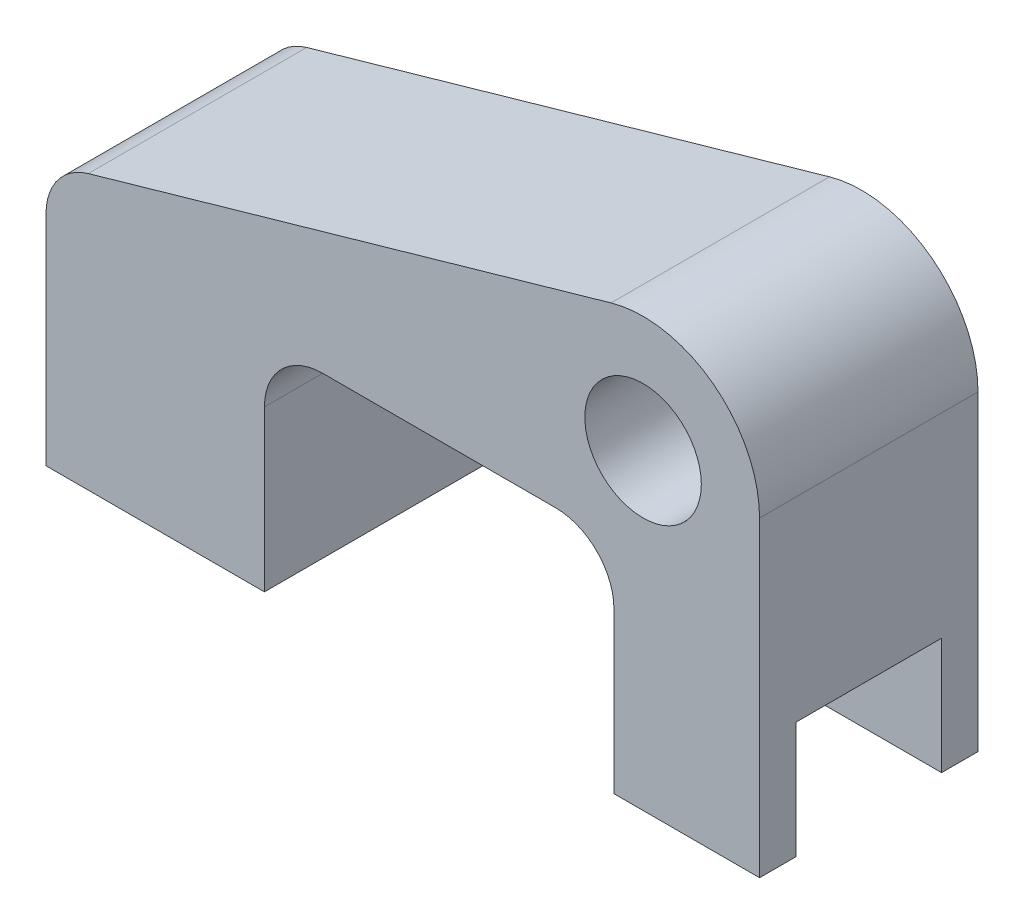
ISO-10303-21;
HEADER;
FILE_DESCRIPTION(('STEP AP214'),'2;1');
FILE_NAME('part.step','',(''),(''),'','','');
FILE_SCHEMA(('AUTOMOTIVE_DESIGN { 1 0 10303 214 1 1 1 1 }'));
ENDSEC;
DATA;
#1=APPLICATION_CONTEXT('core data for automotive mechanical design processes');
#2=APPLICATION_PROTOCOL_DEFINITION('international standard','automotive_design',2000,#1);
#3=PRODUCT_CONTEXT('',#1,'mechanical');
#4=PRODUCT('Part','Part','',(#3));
#5=PRODUCT_RELATED_PRODUCT_CATEGORY('part','',(#4));
#6=PRODUCT_DEFINITION_FORMATION('','',#4);
#7=PRODUCT_DEFINITION_CONTEXT('part definition',#1,'design');
#8=PRODUCT_DEFINITION('design','',#6,#7);
#9=PRODUCT_DEFINITION_SHAPE('','',#8);
#10=(LENGTH_UNIT() NAMED_UNIT(*) SI_UNIT(.MILLI.,.METRE.));
#11=(NAMED_UNIT(*) PLANE_ANGLE_UNIT() SI_UNIT($,.RADIAN.));
#12=(NAMED_UNIT(*) SI_UNIT($,.STERADIAN.) SOLID_ANGLE_UNIT());
#13=UNCERTAINTY_MEASURE_WITH_UNIT(LENGTH_MEASURE(1.E-05),#10,'distance_accuracy_value','');
#14=(GEOMETRIC_REPRESENTATION_CONTEXT(3) GLOBAL_UNCERTAINTY_ASSIGNED_CONTEXT((#13)) GLOBAL_UNIT_ASSIGNED_CONTEXT((#10,
#11,#12)) REPRESENTATION_CONTEXT('',''));
#15=CARTESIAN_POINT('',(0.,0.,0.));
#16=DIRECTION('',(0.,0.,1.));
#17=DIRECTION('',(1.,0.,0.));
#18=AXIS2_PLACEMENT_3D('',#15,#16,#17);
#19=CARTESIAN_POINT('',(18.3252312049049,17.4852420809224,15.));
#20=DIRECTION('',(1.,0.,0.));
#21=DIRECTION('',(0.,1.,0.));
#22=AXIS2_PLACEMENT_3D('',#19,#20,#21);
#23=PLANE('',#22);
#24=DIRECTION('',(0.,-1.,0.));
#25=VECTOR('',#24,1.);
#26=CARTESIAN_POINT('',(18.3252312049049,17.4852420809224,2.5));
#27=LINE('',#26,#25);
#28=CARTESIAN_POINT('',(18.3252312049049,10.4852420809224,2.5));
#29=VERTEX_POINT('',#28);
#30=CARTESIAN_POINT('',(18.3252312049049,2.48524208092244,2.5));
#31=VERTEX_POINT('',#30);
#32=EDGE_CURVE('E51',#29,#31,#27,.T.);
#33=ORIENTED_EDGE('',*,*,#32,.F.);
#34=DIRECTION('',(0.,0.,-1.));
#35=VECTOR('',#34,1.);
#36=CARTESIAN_POINT('',(18.3252312049049,10.4852420809224,15.));
#37=LINE('',#36,#35);
#38=CARTESIAN_POINT('',(18.3252312049049,10.4852420809224,12.5));
#39=VERTEX_POINT('',#38);
#40=EDGE_CURVE('E55',#39,#29,#37,.T.);
#41=ORIENTED_EDGE('',*,*,#40,.F.);
#42=DIRECTION('',(0.,1.,0.));
#43=VECTOR('',#42,1.);
#44=CARTESIAN_POINT('',(18.3252312049049,17.4852420809224,12.5));
#45=LINE('',#44,#43);
#46=CARTESIAN_POINT('',(18.3252312049049,2.48524208092244,12.5));
#47=VERTEX_POINT('',#46);
#48=EDGE_CURVE('E184',#47,#39,#45,.T.);
#49=ORIENTED_EDGE('',*,*,#48,.F.);
#50=DIRECTION('',(0.,0.,-1.));
#51=VECTOR('',#50,1.);
#52=CARTESIAN_POINT('',(18.3252312049049,2.48524208092244,15.));
#53=LINE('',#52,#51);
#54=CARTESIAN_POINT('',(18.3252312049049,2.48524208092244,15.));
#55=VERTEX_POINT('',#54);
#56=EDGE_CURVE('E165',#55,#47,#53,.T.);
#57=ORIENTED_EDGE('',*,*,#56,.F.);
#58=DIRECTION('',(0.,-1.,0.));
#59=VECTOR('',#58,1.);
#60=CARTESIAN_POINT('',(18.3252312049049,17.4852420809224,15.));
#61=LINE('',#60,#59);
#62=CARTESIAN_POINT('',(18.3252312049049,13.4852420809224,15.));
#63=VERTEX_POINT('',#62);
#64=EDGE_CURVE('E212',#63,#55,#61,.T.);
#65=ORIENTED_EDGE('',*,*,#64,.F.);
#66=DIRECTION('',(0.,0.,-1.));
#67=VECTOR('',#66,1.);
#68=CARTESIAN_POINT('',(18.3252312049049,13.4852420809224,0.));
#69=LINE('',#68,#67);
#70=CARTESIAN_POINT('',(18.3252312049049,13.4852420809224,0.));
#71=VERTEX_POINT('',#70);
#72=EDGE_CURVE('E274',#63,#71,#69,.T.);
#73=ORIENTED_EDGE('',*,*,#72,.T.);
#74=DIRECTION('',(0.,-1.,0.));
#75=VECTOR('',#74,1.);
#76=CARTESIAN_POINT('',(18.3252312049049,17.4852420809224,0.));
#77=LINE('',#76,#75);
#78=CARTESIAN_POINT('',(18.3252312049049,2.48524208092244,0.));
#79=VERTEX_POINT('',#78);
#80=EDGE_CURVE('E229',#71,#79,#77,.T.);
#81=ORIENTED_EDGE('',*,*,#80,.T.);
#82=EDGE_CURVE('E157',#31,#79,#53,.T.);
#83=ORIENTED_EDGE('',*,*,#82,.F.);
#84=EDGE_LOOP('',(#33,#41,#49,#57,#65,#73,#81,#83));
#85=FACE_BOUND('',#84,.T.);
#86=ADVANCED_FACE('F36',(#85),#23,.F.);
#87=CARTESIAN_POINT('',(18.3252312049049,2.48524208092244,15.));
#88=DIRECTION('',(0.,1.,0.));
#89=DIRECTION('',(-1.,0.,0.));
#90=AXIS2_PLACEMENT_3D('',#87,#88,#89);
#91=PLANE('',#90);
#92=DIRECTION('',(-1.,0.,0.));
#93=VECTOR('',#92,1.);
#94=CARTESIAN_POINT('',(163.420684788137,2.48524208092244,2.5));
#95=LINE('',#94,#93);
#96=CARTESIAN_POINT('',(28.3252312049049,2.48524208092243,2.5));
#97=VERTEX_POINT('',#96);
#98=EDGE_CURVE('E182',#97,#31,#95,.T.);
#99=ORIENTED_EDGE('',*,*,#98,.T.);
#100=ORIENTED_EDGE('',*,*,#82,.T.);
#101=DIRECTION('',(1.,0.,0.));
#102=VECTOR('',#101,1.);
#103=CARTESIAN_POINT('',(18.3252312049049,2.48524208092244,0.));
#104=LINE('',#103,#102);
#105=CARTESIAN_POINT('',(28.3252312049049,2.48524208092243,0.));
#106=VERTEX_POINT('',#105);
#107=EDGE_CURVE('E232',#79,#106,#104,.T.);
#108=ORIENTED_EDGE('',*,*,#107,.T.);
#109=DIRECTION('',(0.,0.,-1.));
#110=VECTOR('',#109,1.);
#111=CARTESIAN_POINT('',(28.3252312049049,2.48524208092243,15.));
#112=LINE('',#111,#110);
#113=EDGE_CURVE('E158',#97,#106,#112,.T.);
#114=ORIENTED_EDGE('',*,*,#113,.F.);
#115=EDGE_LOOP('',(#99,#100,#108,#114));
#116=FACE_BOUND('',#115,.T.);
#117=ADVANCED_FACE('F338',(#116),#91,.F.);
#118=DIRECTION('',(-1.,0.,0.));
#119=VECTOR('',#118,1.);
#120=CARTESIAN_POINT('',(163.420684788137,2.48524208092243,12.5));
#121=LINE('',#120,#119);
#122=CARTESIAN_POINT('',(28.3252312049049,2.48524208092243,12.5));
#123=VERTEX_POINT('',#122);
#124=EDGE_CURVE('E162',#123,#47,#121,.T.);
#125=ORIENTED_EDGE('',*,*,#124,.F.);
#126=CARTESIAN_POINT('',(28.3252312049049,2.48524208092243,15.));
#127=VERTEX_POINT('',#126);
#128=EDGE_CURVE('E147',#127,#123,#112,.T.);
#129=ORIENTED_EDGE('',*,*,#128,.F.);
#130=DIRECTION('',(1.,0.,0.));
#131=VECTOR('',#130,1.);
#132=CARTESIAN_POINT('',(18.3252312049049,2.48524208092244,15.));
#133=LINE('',#132,#131);
#134=EDGE_CURVE('E214',#55,#127,#133,.T.);
#135=ORIENTED_EDGE('',*,*,#134,.F.);
#136=ORIENTED_EDGE('',*,*,#56,.T.);
#137=EDGE_LOOP('',(#125,#129,#135,#136));
#138=FACE_BOUND('',#137,.T.);
#139=ADVANCED_FACE('F163',(#138),#91,.F.);
#140=CARTESIAN_POINT('',(28.3252312049049,2.48524208092243,15.));
#141=DIRECTION('',(-1.,0.,0.));
#142=DIRECTION('',(0.,0.,1.));
#143=AXIS2_PLACEMENT_3D('',#140,#141,#142);
#144=PLANE('',#143);
#145=DIRECTION('',(0.,-1.,0.));
#146=VECTOR('',#145,1.);
#147=CARTESIAN_POINT('',(28.3252312049049,2.48524208092244,2.5));
#148=LINE('',#147,#146);
#149=CARTESIAN_POINT('',(28.3252312049049,10.4852420809224,2.5));
#150=VERTEX_POINT('',#149);
#151=EDGE_CURVE('E174',#150,#97,#148,.T.);
#152=ORIENTED_EDGE('',*,*,#151,.T.);
#153=ORIENTED_EDGE('',*,*,#113,.T.);
#154=DIRECTION('',(0.,1.,0.));
#155=VECTOR('',#154,1.);
#156=CARTESIAN_POINT('',(28.3252312049049,2.48524208092243,0.));
#157=LINE('',#156,#155);
#158=CARTESIAN_POINT('',(28.3252312049049,23.879402207459,0.));
#159=VERTEX_POINT('',#158);
#160=EDGE_CURVE('E235',#106,#159,#157,.T.);
#161=ORIENTED_EDGE('',*,*,#160,.T.);
#162=DIRECTION('',(0.,0.,-1.));
#163=VECTOR('',#162,1.);
#164=CARTESIAN_POINT('',(28.3252312049049,23.879402207459,15.));
#165=LINE('',#164,#163);
#166=CARTESIAN_POINT('',(28.3252312049049,23.879402207459,15.));
#167=VERTEX_POINT('',#166);
#168=EDGE_CURVE('E252',#159,#167,#165,.F.);
#169=ORIENTED_EDGE('',*,*,#168,.T.);
#170=DIRECTION('',(0.,1.,0.));
#171=VECTOR('',#170,1.);
#172=CARTESIAN_POINT('',(28.3252312049049,2.48524208092243,15.));
#173=LINE('',#172,#171);
#174=EDGE_CURVE('E154',#127,#167,#173,.T.);
#175=ORIENTED_EDGE('',*,*,#174,.F.);
#176=ORIENTED_EDGE('',*,*,#128,.T.);
#177=DIRECTION('',(0.,1.,0.));
#178=VECTOR('',#177,1.);
#179=CARTESIAN_POINT('',(28.3252312049049,2.48524208092243,12.5));
#180=LINE('',#179,#178);
#181=CARTESIAN_POINT('',(28.3252312049049,10.4852420809224,12.5));
#182=VERTEX_POINT('',#181);
#183=EDGE_CURVE('E151',#123,#182,#180,.T.);
#184=ORIENTED_EDGE('',*,*,#183,.T.);
#185=DIRECTION('',(0.,0.,-1.));
#186=VECTOR('',#185,1.);
#187=CARTESIAN_POINT('',(28.3252312049049,10.4852420809224,12.5));
#188=LINE('',#187,#186);
#189=EDGE_CURVE('E172',#182,#150,#188,.T.);
#190=ORIENTED_EDGE('',*,*,#189,.T.);
#191=EDGE_LOOP('',(#152,#153,#161,#169,#175,#176,#184,#190));
#192=FACE_BOUND('',#191,.T.);
#193=ADVANCED_FACE('F149',(#192),#144,.F.);
#194=CARTESIAN_POINT('',(-20.6747687950951,20.4852420809224,15.));
#195=DIRECTION('',(1.,0.,0.));
#196=DIRECTION('',(0.,1.,0.));
#197=AXIS2_PLACEMENT_3D('',#194,#195,#196);
#198=PLANE('',#197);
#199=DIRECTION('',(0.,-1.,0.));
#200=VECTOR('',#199,1.);
#201=CARTESIAN_POINT('',(-20.6747687950951,20.4852420809224,15.));
#202=LINE('',#201,#200);
#203=CARTESIAN_POINT('',(-20.6747687950951,17.468036429905,15.));
#204=VERTEX_POINT('',#203);
#205=CARTESIAN_POINT('',(-20.6747687950951,2.48524208092243,15.));
#206=VERTEX_POINT('',#205);
#207=EDGE_CURVE('E201',#204,#206,#202,.T.);
#208=ORIENTED_EDGE('',*,*,#207,.F.);
#209=DIRECTION('',(0.,0.,-1.));
#210=VECTOR('',#209,1.);
#211=CARTESIAN_POINT('',(-20.6747687950951,17.468036429905,15.));
#212=LINE('',#211,#210);
#213=CARTESIAN_POINT('',(-20.6747687950951,17.468036429905,0.));
#214=VERTEX_POINT('',#213);
#215=EDGE_CURVE('E256',#204,#214,#212,.T.);
#216=ORIENTED_EDGE('',*,*,#215,.T.);
#217=DIRECTION('',(0.,-1.,0.));
#218=VECTOR('',#217,1.);
#219=CARTESIAN_POINT('',(-20.6747687950951,20.4852420809224,0.));
#220=LINE('',#219,#218);
#221=CARTESIAN_POINT('',(-20.6747687950951,2.48524208092243,0.));
#222=VERTEX_POINT('',#221);
#223=EDGE_CURVE('E198',#214,#222,#220,.T.);
#224=ORIENTED_EDGE('',*,*,#223,.T.);
#225=DIRECTION('',(0.,0.,-1.));
#226=VECTOR('',#225,1.);
#227=CARTESIAN_POINT('',(-20.6747687950951,2.48524208092243,15.));
#228=LINE('',#227,#226);
#229=EDGE_CURVE('E244',#206,#222,#228,.T.);
#230=ORIENTED_EDGE('',*,*,#229,.F.);
#231=EDGE_LOOP('',(#208,#216,#224,#230));
#232=FACE_BOUND('',#231,.T.);
#233=ADVANCED_FACE('F313',(#232),#198,.F.);
#234=CARTESIAN_POINT('',(-20.6747687950951,2.48524208092243,15.));
#235=DIRECTION('',(0.,1.,0.));
#236=DIRECTION('',(0.,0.,1.));
#237=AXIS2_PLACEMENT_3D('',#234,#235,#236);
#238=PLANE('',#237);
#239=CARTESIAN_POINT('',(-13.3231411043284,2.48524208092243,7.5));
#240=DIRECTION('',(0.,-1.,0.));
#241=DIRECTION('',(0.,0.,-1.));
#242=AXIS2_PLACEMENT_3D('',#239,#240,#241);
#243=CIRCLE('',#242,1.5);
#244=CARTESIAN_POINT('',(-13.3231411043284,2.48524208092243,6.));
#245=VERTEX_POINT('',#244);
#246=EDGE_CURVE('E188',#245,#245,#243,.T.);
#247=ORIENTED_EDGE('',*,*,#246,.F.);
#248=EDGE_LOOP('',(#247));
#249=FACE_BOUND('',#248,.T.);
#250=DIRECTION('',(1.,0.,0.));
#251=VECTOR('',#250,1.);
#252=CARTESIAN_POINT('',(-20.6747687950951,2.48524208092243,0.));
#253=LINE('',#252,#251);
#254=CARTESIAN_POINT('',(-5.67476879509513,2.48524208092243,0.));
#255=VERTEX_POINT('',#254);
#256=EDGE_CURVE('E221',#222,#255,#253,.T.);
#257=ORIENTED_EDGE('',*,*,#256,.T.);
#258=DIRECTION('',(0.,0.,-1.));
#259=VECTOR('',#258,1.);
#260=CARTESIAN_POINT('',(-5.67476879509513,2.48524208092243,15.));
#261=LINE('',#260,#259);
#262=CARTESIAN_POINT('',(-5.67476879509513,2.48524208092243,15.));
#263=VERTEX_POINT('',#262);
#264=EDGE_CURVE('E241',#263,#255,#261,.T.);
#265=ORIENTED_EDGE('',*,*,#264,.F.);
#266=DIRECTION('',(1.,0.,0.));
#267=VECTOR('',#266,1.);
#268=CARTESIAN_POINT('',(-20.6747687950951,2.48524208092243,15.));
#269=LINE('',#268,#267);
#270=EDGE_CURVE('E203',#206,#263,#269,.T.);
#271=ORIENTED_EDGE('',*,*,#270,.F.);
#272=ORIENTED_EDGE('',*,*,#229,.T.);
#273=EDGE_LOOP('',(#257,#265,#271,#272));
#274=FACE_BOUND('',#273,.T.);
#275=ADVANCED_FACE('F318',(#249,#274),#238,.F.);
#276=CARTESIAN_POINT('',(-5.67476879509513,2.48524208092243,15.));
#277=DIRECTION('',(-1.,0.,0.));
#278=DIRECTION('',(0.,0.,1.));
#279=AXIS2_PLACEMENT_3D('',#276,#277,#278);
#280=PLANE('',#279);
#281=DIRECTION('',(0.,1.,0.));
#282=VECTOR('',#281,1.);
#283=CARTESIAN_POINT('',(-5.67476879509513,2.48524208092243,0.));
#284=LINE('',#283,#282);
#285=CARTESIAN_POINT('',(-5.67476879509513,13.4852420809224,0.));
#286=VERTEX_POINT('',#285);
#287=EDGE_CURVE('E223',#255,#286,#284,.T.);
#288=ORIENTED_EDGE('',*,*,#287,.T.);
#289=DIRECTION('',(0.,0.,-1.));
#290=VECTOR('',#289,1.);
#291=CARTESIAN_POINT('',(-5.67476879509513,13.4852420809224,15.));
#292=LINE('',#291,#290);
#293=CARTESIAN_POINT('',(-5.67476879509513,13.4852420809224,15.));
#294=VERTEX_POINT('',#293);
#295=EDGE_CURVE('E268',#286,#294,#292,.F.);
#296=ORIENTED_EDGE('',*,*,#295,.T.);
#297=DIRECTION('',(0.,1.,0.));
#298=VECTOR('',#297,1.);
#299=CARTESIAN_POINT('',(-5.67476879509513,2.48524208092243,15.));
#300=LINE('',#299,#298);
#301=EDGE_CURVE('E206',#263,#294,#300,.T.);
#302=ORIENTED_EDGE('',*,*,#301,.F.);
#303=ORIENTED_EDGE('',*,*,#264,.T.);
#304=EDGE_LOOP('',(#288,#296,#302,#303));
#305=FACE_BOUND('',#304,.T.);
#306=ADVANCED_FACE('F322',(#305),#280,.F.);
#307=CARTESIAN_POINT('',(-5.67476879509513,17.4852420809224,15.));
#308=DIRECTION('',(0.,1.,0.));
#309=DIRECTION('',(0.,0.,1.));
#310=AXIS2_PLACEMENT_3D('',#307,#308,#309);
#311=PLANE('',#310);
#312=DIRECTION('',(1.,0.,0.));
#313=VECTOR('',#312,1.);
#314=CARTESIAN_POINT('',(-5.67476879509513,17.4852420809224,0.));
#315=LINE('',#314,#313);
#316=CARTESIAN_POINT('',(-1.67476879509513,17.4852420809224,0.));
#317=VERTEX_POINT('',#316);
#318=CARTESIAN_POINT('',(14.3252312049049,17.4852420809224,0.));
#319=VERTEX_POINT('',#318);
#320=EDGE_CURVE('E226',#317,#319,#315,.T.);
#321=ORIENTED_EDGE('',*,*,#320,.T.);
#322=DIRECTION('',(0.,0.,-1.));
#323=VECTOR('',#322,1.);
#324=CARTESIAN_POINT('',(14.3252312049049,17.4852420809224,15.));
#325=LINE('',#324,#323);
#326=CARTESIAN_POINT('',(14.3252312049049,17.4852420809224,15.));
#327=VERTEX_POINT('',#326);
#328=EDGE_CURVE('E277',#319,#327,#325,.F.);
#329=ORIENTED_EDGE('',*,*,#328,.T.);
#330=DIRECTION('',(1.,0.,0.));
#331=VECTOR('',#330,1.);
#332=CARTESIAN_POINT('',(-5.67476879509513,17.4852420809224,15.));
#333=LINE('',#332,#331);
#334=CARTESIAN_POINT('',(-1.67476879509513,17.4852420809224,15.));
#335=VERTEX_POINT('',#334);
#336=EDGE_CURVE('E209',#335,#327,#333,.T.);
#337=ORIENTED_EDGE('',*,*,#336,.F.);
#338=DIRECTION('',(0.,0.,-1.));
#339=VECTOR('',#338,1.);
#340=CARTESIAN_POINT('',(-1.67476879509513,17.4852420809224,0.));
#341=LINE('',#340,#339);
#342=EDGE_CURVE('E265',#335,#317,#341,.T.);
#343=ORIENTED_EDGE('',*,*,#342,.T.);
#344=EDGE_LOOP('',(#321,#329,#337,#343));
#345=FACE_BOUND('',#344,.T.);
#346=ADVANCED_FACE('F288',(#345),#311,.F.);
#347=CARTESIAN_POINT('',(28.3252312049049,34.4852420809224,15.));
#348=DIRECTION('',(0.274721127897378,-0.961523947640823,0.));
#349=DIRECTION('',(0.961523947640823,0.274721127897378,0.));
#350=AXIS2_PLACEMENT_3D('',#347,#348,#349);
#351=PLANE('',#350);
#352=DIRECTION('',(-0.961523947640823,-0.274721127897378,0.));
#353=VECTOR('',#352,1.);
#354=CARTESIAN_POINT('',(28.3252312049049,34.4852420809224,0.));
#355=LINE('',#354,#353);
#356=CARTESIAN_POINT('',(18.1274621817259,31.5715937885856,0.));
#357=VERTEX_POINT('',#356);
#358=CARTESIAN_POINT('',(-17.7736533066846,21.3141322204683,0.));
#359=VERTEX_POINT('',#358);
#360=EDGE_CURVE('E204',#357,#359,#355,.T.);
#361=ORIENTED_EDGE('',*,*,#360,.T.);
#362=DIRECTION('',(0.,0.,-1.));
#363=VECTOR('',#362,1.);
#364=CARTESIAN_POINT('',(-17.7736533066846,21.3141322204683,15.));
#365=LINE('',#364,#363);
#366=CARTESIAN_POINT('',(-17.7736533066846,21.3141322204683,15.));
#367=VERTEX_POINT('',#366);
#368=EDGE_CURVE('E261',#359,#367,#365,.F.);
#369=ORIENTED_EDGE('',*,*,#368,.T.);
#370=DIRECTION('',(-0.961523947640823,-0.274721127897378,0.));
#371=VECTOR('',#370,1.);
#372=CARTESIAN_POINT('',(28.3252312049049,34.4852420809224,15.));
#373=LINE('',#372,#371);
#374=CARTESIAN_POINT('',(18.1274621817259,31.5715937885856,15.));
#375=VERTEX_POINT('',#374);
#376=EDGE_CURVE('E217',#375,#367,#373,.T.);
#377=ORIENTED_EDGE('',*,*,#376,.F.);
#378=DIRECTION('',(0.,0.,-1.));
#379=VECTOR('',#378,1.);
#380=CARTESIAN_POINT('',(18.1274621817258,31.5715937885856,15.));
#381=LINE('',#380,#379);
#382=EDGE_CURVE('E247',#375,#357,#381,.T.);
#383=ORIENTED_EDGE('',*,*,#382,.T.);
#384=EDGE_LOOP('',(#361,#369,#377,#383));
#385=FACE_BOUND('',#384,.T.);
#386=ADVANCED_FACE('F303',(#385),#351,.F.);
#387=CARTESIAN_POINT('',(0.,0.,15.));
#388=DIRECTION('',(0.,0.,1.));
#389=DIRECTION('',(1.,0.,0.));
#390=AXIS2_PLACEMENT_3D('',#387,#388,#389);
#391=PLANE('',#390);
#392=CARTESIAN_POINT('',(20.3252312049049,23.879402207459,15.));
#393=DIRECTION('',(0.,0.,1.));
#394=DIRECTION('',(1.,0.,0.));
#395=AXIS2_PLACEMENT_3D('',#392,#393,#394);
#396=CIRCLE('',#395,4.);
#397=CARTESIAN_POINT('',(24.3252312049049,23.879402207459,15.));
#398=VERTEX_POINT('',#397);
#399=EDGE_CURVE('E192',#398,#398,#396,.T.);
#400=ORIENTED_EDGE('',*,*,#399,.F.);
#401=EDGE_LOOP('',(#400));
#402=FACE_BOUND('',#401,.T.);
#403=ORIENTED_EDGE('',*,*,#376,.T.);
#404=CARTESIAN_POINT('',(-16.6747687950951,17.468036429905,15.));
#405=DIRECTION('',(0.,0.,1.));
#406=DIRECTION('',(1.,0.,0.));
#407=AXIS2_PLACEMENT_3D('',#404,#405,#406);
#408=CIRCLE('',#407,4.);
#409=EDGE_CURVE('E263',#367,#204,#408,.T.);
#410=ORIENTED_EDGE('',*,*,#409,.T.);
#411=ORIENTED_EDGE('',*,*,#207,.T.);
#412=ORIENTED_EDGE('',*,*,#270,.T.);
#413=ORIENTED_EDGE('',*,*,#301,.T.);
#414=CARTESIAN_POINT('',(-1.67476879509513,13.4852420809224,15.));
#415=DIRECTION('',(0.,0.,1.));
#416=DIRECTION('',(1.,0.,0.));
#417=AXIS2_PLACEMENT_3D('',#414,#415,#416);
#418=CIRCLE('',#417,4.);
#419=EDGE_CURVE('E272',#294,#335,#418,.F.);
#420=ORIENTED_EDGE('',*,*,#419,.T.);
#421=ORIENTED_EDGE('',*,*,#336,.T.);
#422=CARTESIAN_POINT('',(14.3252312049049,13.4852420809224,15.));
#423=DIRECTION('',(0.,0.,1.));
#424=DIRECTION('',(1.,0.,0.));
#425=AXIS2_PLACEMENT_3D('',#422,#423,#424);
#426=CIRCLE('',#425,4.);
#427=EDGE_CURVE('E11',#327,#63,#426,.F.);
#428=ORIENTED_EDGE('',*,*,#427,.T.);
#429=ORIENTED_EDGE('',*,*,#64,.T.);
#430=ORIENTED_EDGE('',*,*,#134,.T.);
#431=ORIENTED_EDGE('',*,*,#174,.T.);
#432=CARTESIAN_POINT('',(20.3252312049049,23.879402207459,15.));
#433=DIRECTION('',(0.,0.,1.));
#434=DIRECTION('',(1.,0.,0.));
#435=AXIS2_PLACEMENT_3D('',#432,#433,#434);
#436=CIRCLE('',#435,8.);
#437=EDGE_CURVE('E254',#167,#375,#436,.T.);
#438=ORIENTED_EDGE('',*,*,#437,.T.);
#439=EDGE_LOOP('',(#403,#410,#411,#412,#413,#420,#421,#428,#429,#430,#431,#438));
#440=FACE_BOUND('',#439,.T.);
#441=ADVANCED_FACE('F294',(#402,#440),#391,.T.);
#442=CARTESIAN_POINT('',(0.,0.,0.));
#443=DIRECTION('',(0.,0.,1.));
#444=DIRECTION('',(1.,0.,0.));
#445=AXIS2_PLACEMENT_3D('',#442,#443,#444);
#446=PLANE('',#445);
#447=CARTESIAN_POINT('',(20.3252312049049,23.879402207459,0.));
#448=DIRECTION('',(0.,0.,1.));
#449=DIRECTION('',(1.,0.,0.));
#450=AXIS2_PLACEMENT_3D('',#447,#448,#449);
#451=CIRCLE('',#450,4.);
#452=CARTESIAN_POINT('',(24.3252312049049,23.879402207459,0.));
#453=VERTEX_POINT('',#452);
#454=EDGE_CURVE('E195',#453,#453,#451,.T.);
#455=ORIENTED_EDGE('',*,*,#454,.T.);
#456=EDGE_LOOP('',(#455));
#457=FACE_BOUND('',#456,.T.);
#458=ORIENTED_EDGE('',*,*,#223,.F.);
#459=CARTESIAN_POINT('',(-16.6747687950951,17.468036429905,0.));
#460=DIRECTION('',(0.,0.,1.));
#461=DIRECTION('',(1.,0.,0.));
#462=AXIS2_PLACEMENT_3D('',#459,#460,#461);
#463=CIRCLE('',#462,4.);
#464=EDGE_CURVE('E259',#214,#359,#463,.F.);
#465=ORIENTED_EDGE('',*,*,#464,.T.);
#466=ORIENTED_EDGE('',*,*,#360,.F.);
#467=CARTESIAN_POINT('',(20.3252312049049,23.879402207459,0.));
#468=DIRECTION('',(0.,0.,1.));
#469=DIRECTION('',(1.,0.,0.));
#470=AXIS2_PLACEMENT_3D('',#467,#468,#469);
#471=CIRCLE('',#470,8.);
#472=EDGE_CURVE('E250',#357,#159,#471,.F.);
#473=ORIENTED_EDGE('',*,*,#472,.T.);
#474=ORIENTED_EDGE('',*,*,#160,.F.);
#475=ORIENTED_EDGE('',*,*,#107,.F.);
#476=ORIENTED_EDGE('',*,*,#80,.F.);
#477=CARTESIAN_POINT('',(14.3252312049049,13.4852420809224,0.));
#478=DIRECTION('',(0.,0.,1.));
#479=DIRECTION('',(1.,0.,0.));
#480=AXIS2_PLACEMENT_3D('',#477,#478,#479);
#481=CIRCLE('',#480,4.);
#482=EDGE_CURVE('E44',#71,#319,#481,.T.);
#483=ORIENTED_EDGE('',*,*,#482,.T.);
#484=ORIENTED_EDGE('',*,*,#320,.F.);
#485=CARTESIAN_POINT('',(-1.67476879509513,13.4852420809224,0.));
#486=DIRECTION('',(0.,0.,1.));
#487=DIRECTION('',(1.,0.,0.));
#488=AXIS2_PLACEMENT_3D('',#485,#486,#487);
#489=CIRCLE('',#488,4.);
#490=EDGE_CURVE('E270',#317,#286,#489,.T.);
#491=ORIENTED_EDGE('',*,*,#490,.T.);
#492=ORIENTED_EDGE('',*,*,#287,.F.);
#493=ORIENTED_EDGE('',*,*,#256,.F.);
#494=EDGE_LOOP('',(#458,#465,#466,#473,#474,#475,#476,#483,#484,#491,#492,#493));
#495=FACE_BOUND('',#494,.T.);
#496=ADVANCED_FACE('F282',(#457,#495),#446,.F.);
#497=CARTESIAN_POINT('',(20.3252312049049,23.879402207459,15.));
#498=DIRECTION('',(0.,0.,-1.));
#499=DIRECTION('',(-1.,0.,0.));
#500=AXIS2_PLACEMENT_3D('',#497,#498,#499);
#501=CYLINDRICAL_SURFACE('',#500,8.);
#502=ORIENTED_EDGE('',*,*,#437,.F.);
#503=ORIENTED_EDGE('',*,*,#168,.F.);
#504=ORIENTED_EDGE('',*,*,#472,.F.);
#505=ORIENTED_EDGE('',*,*,#382,.F.);
#506=EDGE_LOOP('',(#502,#503,#504,#505));
#507=FACE_BOUND('',#506,.T.);
#508=ADVANCED_FACE('F300',(#507),#501,.T.);
#509=CARTESIAN_POINT('',(-16.6747687950951,17.468036429905,15.));
#510=DIRECTION('',(0.,0.,-1.));
#511=DIRECTION('',(-1.,0.,0.));
#512=AXIS2_PLACEMENT_3D('',#509,#510,#511);
#513=CYLINDRICAL_SURFACE('',#512,4.);
#514=ORIENTED_EDGE('',*,*,#409,.F.);
#515=ORIENTED_EDGE('',*,*,#368,.F.);
#516=ORIENTED_EDGE('',*,*,#464,.F.);
#517=ORIENTED_EDGE('',*,*,#215,.F.);
#518=EDGE_LOOP('',(#514,#515,#516,#517));
#519=FACE_BOUND('',#518,.T.);
#520=ADVANCED_FACE('F310',(#519),#513,.T.);
#521=CARTESIAN_POINT('',(20.3252312049049,23.879402207459,0.));
#522=DIRECTION('',(0.,0.,1.));
#523=DIRECTION('',(1.,0.,0.));
#524=AXIS2_PLACEMENT_3D('',#521,#522,#523);
#525=CYLINDRICAL_SURFACE('',#524,4.);
#526=ORIENTED_EDGE('',*,*,#454,.F.);
#527=EDGE_LOOP('',(#526));
#528=FACE_BOUND('',#527,.T.);
#529=ORIENTED_EDGE('',*,*,#399,.T.);
#530=EDGE_LOOP('',(#529));
#531=FACE_BOUND('',#530,.T.);
#532=ADVANCED_FACE('F328',(#528,#531),#525,.F.);
#533=CARTESIAN_POINT('',(-1.67476879509513,13.4852420809224,15.));
#534=DIRECTION('',(0.,0.,1.));
#535=DIRECTION('',(1.,0.,0.));
#536=AXIS2_PLACEMENT_3D('',#533,#534,#535);
#537=CYLINDRICAL_SURFACE('',#536,4.);
#538=ORIENTED_EDGE('',*,*,#419,.F.);
#539=ORIENTED_EDGE('',*,*,#295,.F.);
#540=ORIENTED_EDGE('',*,*,#490,.F.);
#541=ORIENTED_EDGE('',*,*,#342,.F.);
#542=EDGE_LOOP('',(#538,#539,#540,#541));
#543=FACE_BOUND('',#542,.T.);
#544=ADVANCED_FACE('F326',(#543),#537,.F.);
#545=CARTESIAN_POINT('',(14.3252312049049,13.4852420809224,15.));
#546=DIRECTION('',(0.,0.,1.));
#547=DIRECTION('',(1.,0.,0.));
#548=AXIS2_PLACEMENT_3D('',#545,#546,#547);
#549=CYLINDRICAL_SURFACE('',#548,4.);
#550=ORIENTED_EDGE('',*,*,#427,.F.);
#551=ORIENTED_EDGE('',*,*,#328,.F.);
#552=ORIENTED_EDGE('',*,*,#482,.F.);
#553=ORIENTED_EDGE('',*,*,#72,.F.);
#554=EDGE_LOOP('',(#550,#551,#552,#553));
#555=FACE_BOUND('',#554,.T.);
#556=ADVANCED_FACE('F38',(#555),#549,.F.);
#557=CARTESIAN_POINT('',(-13.3231411043284,12.4852420809224,7.5));
#558=DIRECTION('',(0.,-1.,0.));
#559=DIRECTION('',(0.,0.,-1.));
#560=AXIS2_PLACEMENT_3D('',#557,#558,#559);
#561=CYLINDRICAL_SURFACE('',#560,1.5);
#562=CARTESIAN_POINT('',(-13.3231411043284,12.4852420809224,7.5));
#563=DIRECTION('',(0.,-1.,0.));
#564=DIRECTION('',(0.,0.,-1.));
#565=AXIS2_PLACEMENT_3D('',#562,#563,#564);
#566=CIRCLE('',#565,1.5);
#567=CARTESIAN_POINT('',(-13.3231411043284,12.4852420809224,6.));
#568=VERTEX_POINT('',#567);
#569=EDGE_CURVE('E189',#568,#568,#566,.T.);
#570=ORIENTED_EDGE('',*,*,#569,.F.);
#571=EDGE_LOOP('',(#570));
#572=FACE_BOUND('',#571,.T.);
#573=ORIENTED_EDGE('',*,*,#246,.T.);
#574=EDGE_LOOP('',(#573));
#575=FACE_BOUND('',#574,.T.);
#576=ADVANCED_FACE('F333',(#572,#575),#561,.F.);
#577=CARTESIAN_POINT('',(-13.3231411043284,12.4852420809224,7.5));
#578=DIRECTION('',(0.,-1.,0.));
#579=DIRECTION('',(0.,0.,-1.));
#580=AXIS2_PLACEMENT_3D('',#577,#578,#579);
#581=PLANE('',#580);
#582=ORIENTED_EDGE('',*,*,#569,.T.);
#583=EDGE_LOOP('',(#582));
#584=FACE_BOUND('',#583,.T.);
#585=ADVANCED_FACE('F426',(#584),#581,.T.);
#586=CARTESIAN_POINT('',(163.420684788137,2.48524208092244,2.5));
#587=DIRECTION('',(0.,0.,1.));
#588=DIRECTION('',(0.,-1.,0.));
#589=AXIS2_PLACEMENT_3D('',#586,#587,#588);
#590=PLANE('',#589);
#591=DIRECTION('',(-1.,0.,0.));
#592=VECTOR('',#591,1.);
#593=CARTESIAN_POINT('',(163.420684788137,10.4852420809224,2.5));
#594=LINE('',#593,#592);
#595=EDGE_CURVE('E179',#150,#29,#594,.T.);
#596=ORIENTED_EDGE('',*,*,#595,.T.);
#597=ORIENTED_EDGE('',*,*,#32,.T.);
#598=ORIENTED_EDGE('',*,*,#98,.F.);
#599=ORIENTED_EDGE('',*,*,#151,.F.);
#600=EDGE_LOOP('',(#596,#597,#598,#599));
#601=FACE_BOUND('',#600,.T.);
#602=ADVANCED_FACE('F435',(#601),#590,.T.);
#603=CARTESIAN_POINT('',(163.420684788137,10.4852420809224,12.5));
#604=DIRECTION('',(0.,-1.,0.));
#605=DIRECTION('',(0.,0.,-1.));
#606=AXIS2_PLACEMENT_3D('',#603,#604,#605);
#607=PLANE('',#606);
#608=DIRECTION('',(-1.,0.,0.));
#609=VECTOR('',#608,1.);
#610=CARTESIAN_POINT('',(163.420684788137,10.4852420809224,12.5));
#611=LINE('',#610,#609);
#612=EDGE_CURVE('E167',#182,#39,#611,.T.);
#613=ORIENTED_EDGE('',*,*,#612,.T.);
#614=ORIENTED_EDGE('',*,*,#40,.T.);
#615=ORIENTED_EDGE('',*,*,#595,.F.);
#616=ORIENTED_EDGE('',*,*,#189,.F.);
#617=EDGE_LOOP('',(#613,#614,#615,#616));
#618=FACE_BOUND('',#617,.T.);
#619=ADVANCED_FACE('F470',(#618),#607,.T.);
#620=CARTESIAN_POINT('',(163.420684788137,2.48524208092243,12.5));
#621=DIRECTION('',(0.,0.,-1.));
#622=DIRECTION('',(-1.,0.,0.));
#623=AXIS2_PLACEMENT_3D('',#620,#621,#622);
#624=PLANE('',#623);
#625=ORIENTED_EDGE('',*,*,#124,.T.);
#626=ORIENTED_EDGE('',*,*,#48,.T.);
#627=ORIENTED_EDGE('',*,*,#612,.F.);
#628=ORIENTED_EDGE('',*,*,#183,.F.);
#629=EDGE_LOOP('',(#625,#626,#627,#628));
#630=FACE_BOUND('',#629,.T.);
#631=ADVANCED_FACE('F170',(#630),#624,.T.);
#632=CLOSED_SHELL('',(#86,#117,#139,#193,#233,#275,#306,#346,#386,#441,#496,#508,#520,#532,#544,
#556,#576,#585,#602,#619,#631));
#633=MANIFOLD_SOLID_BREP('B2',#632);
#634=ADVANCED_BREP_SHAPE_REPRESENTATION('',(#18,#633),#14);
#635=SHAPE_DEFINITION_REPRESENTATION(#9,#634);
ENDSEC;
END-ISO-10303-21;
